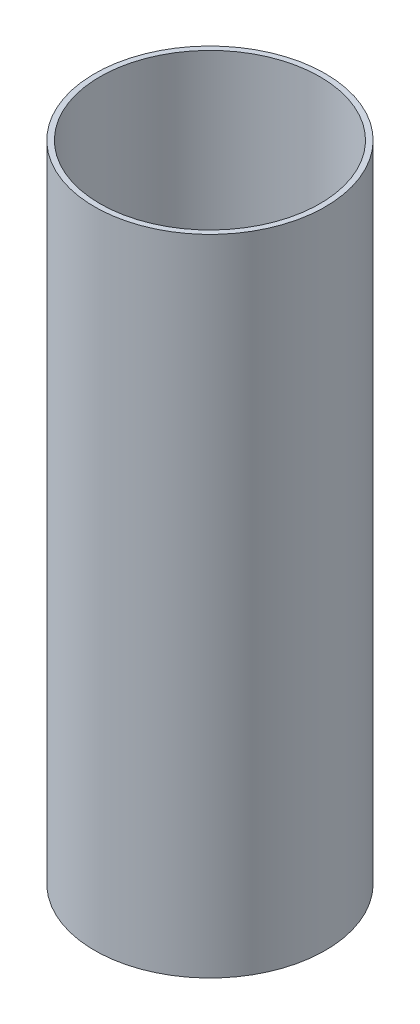
ISO-10303-21;
HEADER;
FILE_DESCRIPTION(('STEP AP214'),'2;1');
FILE_NAME('part.step','',(''),(''),'','','');
FILE_SCHEMA(('AUTOMOTIVE_DESIGN { 1 0 10303 214 1 1 1 1 }'));
ENDSEC;
DATA;
#1=APPLICATION_CONTEXT('core data for automotive mechanical design processes');
#2=APPLICATION_PROTOCOL_DEFINITION('international standard','automotive_design',2000,#1);
#3=PRODUCT_CONTEXT('',#1,'mechanical');
#4=PRODUCT('Part','Part','',(#3));
#5=PRODUCT_RELATED_PRODUCT_CATEGORY('part','',(#4));
#6=PRODUCT_DEFINITION_FORMATION('','',#4);
#7=PRODUCT_DEFINITION_CONTEXT('part definition',#1,'design');
#8=PRODUCT_DEFINITION('design','',#6,#7);
#9=PRODUCT_DEFINITION_SHAPE('','',#8);
#10=(LENGTH_UNIT() NAMED_UNIT(*) SI_UNIT(.MILLI.,.METRE.));
#11=(NAMED_UNIT(*) PLANE_ANGLE_UNIT() SI_UNIT($,.RADIAN.));
#12=(NAMED_UNIT(*) SI_UNIT($,.STERADIAN.) SOLID_ANGLE_UNIT());
#13=UNCERTAINTY_MEASURE_WITH_UNIT(LENGTH_MEASURE(1.E-05),#10,'distance_accuracy_value','');
#14=(GEOMETRIC_REPRESENTATION_CONTEXT(3) GLOBAL_UNCERTAINTY_ASSIGNED_CONTEXT((#13)) GLOBAL_UNIT_ASSIGNED_CONTEXT((#10,
#11,#12)) REPRESENTATION_CONTEXT('',''));
#15=CARTESIAN_POINT('',(0.,0.,0.));
#16=DIRECTION('',(0.,0.,1.));
#17=DIRECTION('',(1.,0.,0.));
#18=AXIS2_PLACEMENT_3D('',#15,#16,#17);
#19=CARTESIAN_POINT('',(32.54375,1.5875,0.));
#20=DIRECTION('',(0.,1.,0.));
#21=DIRECTION('',(0.,0.,1.));
#22=AXIS2_PLACEMENT_3D('',#19,#20,#21);
#23=PLANE('',#22);
#24=CARTESIAN_POINT('',(0.,1.5875,0.));
#25=DIRECTION('',(0.,-1.,0.));
#26=DIRECTION('',(0.,0.,-1.));
#27=AXIS2_PLACEMENT_3D('',#24,#25,#26);
#28=CIRCLE('',#27,32.54375);
#29=CARTESIAN_POINT('',(0.,1.5875,-32.54375));
#30=VERTEX_POINT('',#29);
#31=EDGE_CURVE('E10',#30,#30,#28,.T.);
#32=ORIENTED_EDGE('',*,*,#31,.F.);
#33=EDGE_LOOP('',(#32));
#34=FACE_BOUND('',#33,.T.);
#35=ADVANCED_FACE('F31',(#34),#23,.T.);
#36=CARTESIAN_POINT('',(0.,0.,0.));
#37=DIRECTION('',(0.,-1.,0.));
#38=DIRECTION('',(0.,0.,-1.));
#39=AXIS2_PLACEMENT_3D('',#36,#37,#38);
#40=CYLINDRICAL_SURFACE('',#39,32.54375);
#41=ORIENTED_EDGE('',*,*,#31,.T.);
#42=EDGE_LOOP('',(#41));
#43=FACE_BOUND('',#42,.T.);
#44=CARTESIAN_POINT('',(0.,190.5,0.));
#45=DIRECTION('',(0.,-1.,0.));
#46=DIRECTION('',(0.,0.,-1.));
#47=AXIS2_PLACEMENT_3D('',#44,#45,#46);
#48=CIRCLE('',#47,32.54375);
#49=CARTESIAN_POINT('',(0.,190.5,-32.54375));
#50=VERTEX_POINT('',#49);
#51=EDGE_CURVE('E37',#50,#50,#48,.T.);
#52=ORIENTED_EDGE('',*,*,#51,.F.);
#53=EDGE_LOOP('',(#52));
#54=FACE_BOUND('',#53,.T.);
#55=ADVANCED_FACE('F63',(#43,#54),#40,.F.);
#56=CARTESIAN_POINT('',(34.13125,190.5,0.));
#57=DIRECTION('',(0.,1.,0.));
#58=DIRECTION('',(0.,0.,1.));
#59=AXIS2_PLACEMENT_3D('',#56,#57,#58);
#60=PLANE('',#59);
#61=ORIENTED_EDGE('',*,*,#51,.T.);
#62=EDGE_LOOP('',(#61));
#63=FACE_BOUND('',#62,.T.);
#64=CARTESIAN_POINT('',(0.,190.5,0.));
#65=DIRECTION('',(0.,-1.,0.));
#66=DIRECTION('',(0.,0.,-1.));
#67=AXIS2_PLACEMENT_3D('',#64,#65,#66);
#68=CIRCLE('',#67,34.13125);
#69=CARTESIAN_POINT('',(0.,190.5,-34.13125));
#70=VERTEX_POINT('',#69);
#71=EDGE_CURVE('E41',#70,#70,#68,.T.);
#72=ORIENTED_EDGE('',*,*,#71,.F.);
#73=EDGE_LOOP('',(#72));
#74=FACE_BOUND('',#73,.T.);
#75=ADVANCED_FACE('F55',(#63,#74),#60,.T.);
#76=CARTESIAN_POINT('',(0.,0.,0.));
#77=DIRECTION('',(0.,-1.,0.));
#78=DIRECTION('',(0.,0.,-1.));
#79=AXIS2_PLACEMENT_3D('',#76,#77,#78);
#80=CYLINDRICAL_SURFACE('',#79,34.13125);
#81=ORIENTED_EDGE('',*,*,#71,.T.);
#82=EDGE_LOOP('',(#81));
#83=FACE_BOUND('',#82,.T.);
#84=CARTESIAN_POINT('',(0.,0.,0.));
#85=DIRECTION('',(0.,-1.,0.));
#86=DIRECTION('',(0.,0.,-1.));
#87=AXIS2_PLACEMENT_3D('',#84,#85,#86);
#88=CIRCLE('',#87,34.13125);
#89=CARTESIAN_POINT('',(0.,0.,-34.13125));
#90=VERTEX_POINT('',#89);
#91=EDGE_CURVE('E45',#90,#90,#88,.T.);
#92=ORIENTED_EDGE('',*,*,#91,.F.);
#93=EDGE_LOOP('',(#92));
#94=FACE_BOUND('',#93,.T.);
#95=ADVANCED_FACE('F53',(#83,#94),#80,.T.);
#96=CARTESIAN_POINT('',(34.13125,0.,0.));
#97=DIRECTION('',(0.,-1.,0.));
#98=DIRECTION('',(0.,0.,-1.));
#99=AXIS2_PLACEMENT_3D('',#96,#97,#98);
#100=PLANE('',#99);
#101=ORIENTED_EDGE('',*,*,#91,.T.);
#102=EDGE_LOOP('',(#101));
#103=FACE_BOUND('',#102,.T.);
#104=ADVANCED_FACE('F51',(#103),#100,.T.);
#105=CLOSED_SHELL('',(#35,#55,#75,#95,#104));
#106=MANIFOLD_SOLID_BREP('B2',#105);
#107=ADVANCED_BREP_SHAPE_REPRESENTATION('',(#18,#106),#14);
#108=SHAPE_DEFINITION_REPRESENTATION(#9,#107);
ENDSEC;
END-ISO-10303-21;
